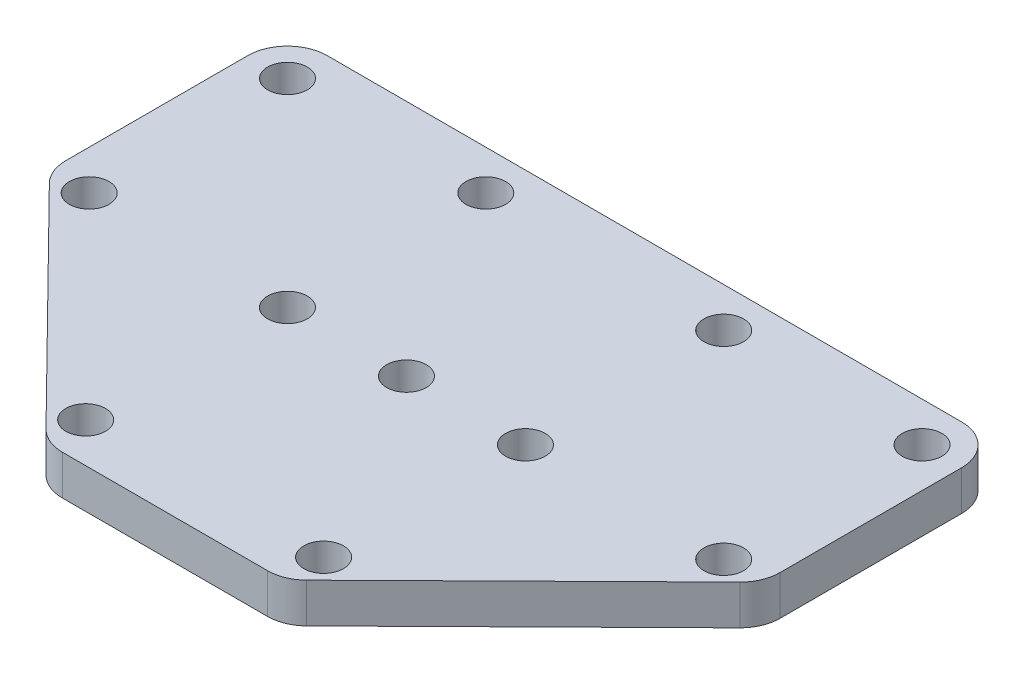
ISO-10303-21;
HEADER;
FILE_DESCRIPTION(('STEP AP214'),'2;1');
FILE_NAME('part.step','',(''),(''),'','','');
FILE_SCHEMA(('AUTOMOTIVE_DESIGN { 1 0 10303 214 1 1 1 1 }'));
ENDSEC;
DATA;
#1=APPLICATION_CONTEXT('core data for automotive mechanical design processes');
#2=APPLICATION_PROTOCOL_DEFINITION('international standard','automotive_design',2000,#1);
#3=PRODUCT_CONTEXT('',#1,'mechanical');
#4=PRODUCT('Part','Part','',(#3));
#5=PRODUCT_RELATED_PRODUCT_CATEGORY('part','',(#4));
#6=PRODUCT_DEFINITION_FORMATION('','',#4);
#7=PRODUCT_DEFINITION_CONTEXT('part definition',#1,'design');
#8=PRODUCT_DEFINITION('design','',#6,#7);
#9=PRODUCT_DEFINITION_SHAPE('','',#8);
#10=(LENGTH_UNIT() NAMED_UNIT(*) SI_UNIT(.MILLI.,.METRE.));
#11=(NAMED_UNIT(*) PLANE_ANGLE_UNIT() SI_UNIT($,.RADIAN.));
#12=(NAMED_UNIT(*) SI_UNIT($,.STERADIAN.) SOLID_ANGLE_UNIT());
#13=UNCERTAINTY_MEASURE_WITH_UNIT(LENGTH_MEASURE(1.E-05),#10,'distance_accuracy_value','');
#14=(GEOMETRIC_REPRESENTATION_CONTEXT(3) GLOBAL_UNCERTAINTY_ASSIGNED_CONTEXT((#13)) GLOBAL_UNIT_ASSIGNED_CONTEXT((#10,
#11,#12)) REPRESENTATION_CONTEXT('',''));
#15=CARTESIAN_POINT('',(0.,0.,0.));
#16=DIRECTION('',(0.,0.,1.));
#17=DIRECTION('',(1.,0.,0.));
#18=AXIS2_PLACEMENT_3D('',#15,#16,#17);
#19=CARTESIAN_POINT('',(-131.471489952786,12.7,-38.2334337337742));
#20=DIRECTION('',(0.,-1.,0.));
#21=DIRECTION('',(0.,0.,-1.));
#22=AXIS2_PLACEMENT_3D('',#19,#20,#21);
#23=CYLINDRICAL_SURFACE('',#22,12.6999999999999);
#24=CARTESIAN_POINT('',(-131.471489952786,0.,-38.2334337337742));
#25=DIRECTION('',(0.,1.,0.));
#26=DIRECTION('',(0.,0.,-1.));
#27=AXIS2_PLACEMENT_3D('',#24,#25,#26);
#28=CIRCLE('',#27,12.6999999999999);
#29=CARTESIAN_POINT('',(-144.171489952786,0.,-38.2334337337742));
#30=VERTEX_POINT('',#29);
#31=CARTESIAN_POINT('',(-140.522107102558,0.,-29.3240942965171));
#32=VERTEX_POINT('',#31);
#33=EDGE_CURVE('E159',#30,#32,#28,.T.);
#34=ORIENTED_EDGE('',*,*,#33,.T.);
#35=DIRECTION('',(0.,-1.,0.));
#36=VECTOR('',#35,1.);
#37=CARTESIAN_POINT('',(-140.522107102558,12.7,-29.3240942965171));
#38=LINE('',#37,#36);
#39=CARTESIAN_POINT('',(-140.522107102558,12.7,-29.3240942965171));
#40=VERTEX_POINT('',#39);
#41=EDGE_CURVE('E11',#40,#32,#38,.T.);
#42=ORIENTED_EDGE('',*,*,#41,.F.);
#43=CARTESIAN_POINT('',(-131.471489952786,12.7,-38.2334337337742));
#44=DIRECTION('',(0.,1.,0.));
#45=DIRECTION('',(0.,0.,-1.));
#46=AXIS2_PLACEMENT_3D('',#43,#44,#45);
#47=CIRCLE('',#46,12.6999999999999);
#48=CARTESIAN_POINT('',(-144.171489952786,12.7,-38.2334337337742));
#49=VERTEX_POINT('',#48);
#50=EDGE_CURVE('E182',#49,#40,#47,.T.);
#51=ORIENTED_EDGE('',*,*,#50,.F.);
#52=DIRECTION('',(0.,-1.,0.));
#53=VECTOR('',#52,1.);
#54=CARTESIAN_POINT('',(-144.171489952786,12.7,-38.2334337337742));
#55=LINE('',#54,#53);
#56=EDGE_CURVE('E155',#49,#30,#55,.T.);
#57=ORIENTED_EDGE('',*,*,#56,.T.);
#58=EDGE_LOOP('',(#34,#42,#51,#57));
#59=FACE_BOUND('',#58,.T.);
#60=ADVANCED_FACE('F39',(#59),#23,.T.);
#61=CARTESIAN_POINT('',(-140.522107102558,12.7,-29.3240942965171));
#62=DIRECTION('',(0.712647019667029,0.,-0.701522790335211));
#63=DIRECTION('',(-0.701522790335211,0.,-0.712647019667029));
#64=AXIS2_PLACEMENT_3D('',#61,#62,#63);
#65=PLANE('',#64);
#66=DIRECTION('',(0.701522790335211,0.,0.712647019667029));
#67=VECTOR('',#66,1.);
#68=CARTESIAN_POINT('',(-140.522107102558,0.,-29.3240942965171));
#69=LINE('',#68,#67);
#70=CARTESIAN_POINT('',(-72.8924409334163,0.,39.3779930775579));
#71=VERTEX_POINT('',#70);
#72=EDGE_CURVE('E162',#32,#71,#69,.T.);
#73=ORIENTED_EDGE('',*,*,#72,.T.);
#74=DIRECTION('',(0.,-1.,0.));
#75=VECTOR('',#74,1.);
#76=CARTESIAN_POINT('',(-72.8924409334163,12.7,39.3779930775579));
#77=LINE('',#76,#75);
#78=CARTESIAN_POINT('',(-72.8924409334163,12.7,39.3779930775579));
#79=VERTEX_POINT('',#78);
#80=EDGE_CURVE('E47',#79,#71,#77,.T.);
#81=ORIENTED_EDGE('',*,*,#80,.F.);
#82=DIRECTION('',(0.701522790335211,0.,0.712647019667029));
#83=VECTOR('',#82,1.);
#84=CARTESIAN_POINT('',(-140.522107102558,12.7,-29.3240942965171));
#85=LINE('',#84,#83);
#86=EDGE_CURVE('E110',#40,#79,#85,.T.);
#87=ORIENTED_EDGE('',*,*,#86,.F.);
#88=ORIENTED_EDGE('',*,*,#41,.T.);
#89=EDGE_LOOP('',(#73,#81,#87,#88));
#90=FACE_BOUND('',#89,.T.);
#91=ADVANCED_FACE('F261',(#90),#65,.F.);
#92=CARTESIAN_POINT('',(-63.8418237836473,12.7,30.4686536403008));
#93=DIRECTION('',(0.,-1.,0.));
#94=DIRECTION('',(0.,0.,-1.));
#95=AXIS2_PLACEMENT_3D('',#92,#93,#94);
#96=CYLINDRICAL_SURFACE('',#95,12.6999999999992);
#97=CARTESIAN_POINT('',(-63.8418237836473,0.,30.4686536403008));
#98=DIRECTION('',(0.,1.,0.));
#99=DIRECTION('',(0.,0.,-1.));
#100=AXIS2_PLACEMENT_3D('',#97,#98,#99);
#101=CIRCLE('',#100,12.6999999999992);
#102=CARTESIAN_POINT('',(-63.8418237836451,0.,43.1686536402999));
#103=VERTEX_POINT('',#102);
#104=EDGE_CURVE('E165',#71,#103,#101,.T.);
#105=ORIENTED_EDGE('',*,*,#104,.T.);
#106=DIRECTION('',(0.,-1.,0.));
#107=VECTOR('',#106,1.);
#108=CARTESIAN_POINT('',(-63.8418237836451,12.7,43.1686536402999));
#109=LINE('',#108,#107);
#110=CARTESIAN_POINT('',(-63.8418237836451,12.7,43.1686536402999));
#111=VERTEX_POINT('',#110);
#112=EDGE_CURVE('E201',#111,#103,#109,.T.);
#113=ORIENTED_EDGE('',*,*,#112,.F.);
#114=CARTESIAN_POINT('',(-63.8418237836473,12.7,30.4686536403008));
#115=DIRECTION('',(0.,1.,0.));
#116=DIRECTION('',(0.,0.,-1.));
#117=AXIS2_PLACEMENT_3D('',#114,#115,#116);
#118=CIRCLE('',#117,12.6999999999992);
#119=EDGE_CURVE('E209',#79,#111,#118,.T.);
#120=ORIENTED_EDGE('',*,*,#119,.F.);
#121=ORIENTED_EDGE('',*,*,#80,.T.);
#122=EDGE_LOOP('',(#105,#113,#120,#121));
#123=FACE_BOUND('',#122,.T.);
#124=ADVANCED_FACE('F207',(#123),#96,.T.);
#125=CARTESIAN_POINT('',(-63.8418237836451,12.7,43.1686536403008));
#126=DIRECTION('',(0.,0.,-1.));
#127=DIRECTION('',(-1.,0.,0.));
#128=AXIS2_PLACEMENT_3D('',#125,#126,#127);
#129=PLANE('',#128);
#130=DIRECTION('',(1.,0.,0.));
#131=VECTOR('',#130,1.);
#132=CARTESIAN_POINT('',(-63.8418237836451,0.,43.1686536403008));
#133=LINE('',#132,#131);
#134=CARTESIAN_POINT('',(1.83605760066149,0.,43.1686536403007));
#135=VERTEX_POINT('',#134);
#136=EDGE_CURVE('E167',#103,#135,#133,.T.);
#137=ORIENTED_EDGE('',*,*,#136,.T.);
#138=DIRECTION('',(0.,-1.,0.));
#139=VECTOR('',#138,1.);
#140=CARTESIAN_POINT('',(1.83605760066149,12.7,43.1686536403007));
#141=LINE('',#140,#139);
#142=CARTESIAN_POINT('',(1.83605760066149,12.7,43.1686536403007));
#143=VERTEX_POINT('',#142);
#144=EDGE_CURVE('E198',#143,#135,#141,.T.);
#145=ORIENTED_EDGE('',*,*,#144,.F.);
#146=DIRECTION('',(1.,0.,0.));
#147=VECTOR('',#146,1.);
#148=CARTESIAN_POINT('',(-63.8418237836451,12.7,43.1686536403008));
#149=LINE('',#148,#147);
#150=EDGE_CURVE('E227',#111,#143,#149,.T.);
#151=ORIENTED_EDGE('',*,*,#150,.F.);
#152=ORIENTED_EDGE('',*,*,#112,.T.);
#153=EDGE_LOOP('',(#137,#145,#151,#152));
#154=FACE_BOUND('',#153,.T.);
#155=ADVANCED_FACE('F218',(#154),#129,.F.);
#156=CARTESIAN_POINT('',(1.83605760065925,12.7,30.4686536403008));
#157=DIRECTION('',(0.,-1.,0.));
#158=DIRECTION('',(0.,0.,-1.));
#159=AXIS2_PLACEMENT_3D('',#156,#157,#158);
#160=CYLINDRICAL_SURFACE('',#159,12.7000000000008);
#161=CARTESIAN_POINT('',(1.83605760065925,0.,30.4686536403008));
#162=DIRECTION('',(0.,1.,0.));
#163=DIRECTION('',(0.,0.,-1.));
#164=AXIS2_PLACEMENT_3D('',#161,#162,#163);
#165=CIRCLE('',#164,12.7000000000008);
#166=CARTESIAN_POINT('',(10.7464996254383,0.,39.5181852813897));
#167=VERTEX_POINT('',#166);
#168=EDGE_CURVE('E169',#135,#167,#165,.T.);
#169=ORIENTED_EDGE('',*,*,#168,.T.);
#170=DIRECTION('',(0.,-1.,0.));
#171=VECTOR('',#170,1.);
#172=CARTESIAN_POINT('',(10.7464996254383,12.7,39.5181852813897));
#173=LINE('',#172,#171);
#174=CARTESIAN_POINT('',(10.7464996254383,12.7,39.5181852813897));
#175=VERTEX_POINT('',#174);
#176=EDGE_CURVE('E195',#175,#167,#173,.T.);
#177=ORIENTED_EDGE('',*,*,#176,.F.);
#178=CARTESIAN_POINT('',(1.83605760065925,12.7,30.4686536403008));
#179=DIRECTION('',(0.,1.,0.));
#180=DIRECTION('',(0.,0.,-1.));
#181=AXIS2_PLACEMENT_3D('',#178,#179,#180);
#182=CIRCLE('',#181,12.7000000000008);
#183=EDGE_CURVE('E224',#143,#175,#182,.T.);
#184=ORIENTED_EDGE('',*,*,#183,.F.);
#185=ORIENTED_EDGE('',*,*,#144,.T.);
#186=EDGE_LOOP('',(#169,#177,#184,#185));
#187=FACE_BOUND('',#186,.T.);
#188=ADVANCED_FACE('F222',(#187),#160,.T.);
#189=CARTESIAN_POINT('',(80.6389520719911,12.7,-29.3000331849449));
#190=DIRECTION('',(-0.701609608250188,0.,-0.712561546542485));
#191=DIRECTION('',(-0.712561546542485,0.,0.701609608250188));
#192=AXIS2_PLACEMENT_3D('',#189,#190,#191);
#193=PLANE('',#192);
#194=DIRECTION('',(0.712561546542485,0.,-0.701609608250188));
#195=VECTOR('',#194,1.);
#196=CARTESIAN_POINT('',(80.6389520719911,0.,-29.3000331849449));
#197=LINE('',#196,#195);
#198=CARTESIAN_POINT('',(80.6389520719911,0.,-29.3000331849449));
#199=VERTEX_POINT('',#198);
#200=EDGE_CURVE('E171',#167,#199,#197,.T.);
#201=ORIENTED_EDGE('',*,*,#200,.T.);
#202=DIRECTION('',(0.,-1.,0.));
#203=VECTOR('',#202,1.);
#204=CARTESIAN_POINT('',(80.6389520719911,12.7,-29.3000331849449));
#205=LINE('',#204,#203);
#206=CARTESIAN_POINT('',(80.6389520719911,12.7,-29.3000331849449));
#207=VERTEX_POINT('',#206);
#208=EDGE_CURVE('E192',#207,#199,#205,.T.);
#209=ORIENTED_EDGE('',*,*,#208,.F.);
#210=DIRECTION('',(0.712561546542485,0.,-0.701609608250188));
#211=VECTOR('',#210,1.);
#212=CARTESIAN_POINT('',(80.6389520719911,12.7,-29.3000331849449));
#213=LINE('',#212,#211);
#214=EDGE_CURVE('E226',#175,#207,#213,.T.);
#215=ORIENTED_EDGE('',*,*,#214,.F.);
#216=ORIENTED_EDGE('',*,*,#176,.T.);
#217=EDGE_LOOP('',(#201,#209,#215,#216));
#218=FACE_BOUND('',#217,.T.);
#219=ADVANCED_FACE('F274',(#218),#193,.F.);
#220=CARTESIAN_POINT('',(71.7285100472137,12.7,-38.3495648260345));
#221=DIRECTION('',(0.,-1.,0.));
#222=DIRECTION('',(0.,0.,-1.));
#223=AXIS2_PLACEMENT_3D('',#220,#221,#222);
#224=CYLINDRICAL_SURFACE('',#223,12.7);
#225=CARTESIAN_POINT('',(71.7285100472137,0.,-38.3495648260345));
#226=DIRECTION('',(0.,1.,0.));
#227=DIRECTION('',(0.,0.,-1.));
#228=AXIS2_PLACEMENT_3D('',#225,#226,#227);
#229=CIRCLE('',#228,12.7);
#230=CARTESIAN_POINT('',(84.4285100472137,0.,-38.3495648260345));
#231=VERTEX_POINT('',#230);
#232=EDGE_CURVE('E173',#199,#231,#229,.T.);
#233=ORIENTED_EDGE('',*,*,#232,.T.);
#234=DIRECTION('',(0.,-1.,0.));
#235=VECTOR('',#234,1.);
#236=CARTESIAN_POINT('',(84.4285100472137,12.7,-38.3495648260345));
#237=LINE('',#236,#235);
#238=CARTESIAN_POINT('',(84.4285100472137,12.7,-38.3495648260345));
#239=VERTEX_POINT('',#238);
#240=EDGE_CURVE('E189',#239,#231,#237,.T.);
#241=ORIENTED_EDGE('',*,*,#240,.F.);
#242=CARTESIAN_POINT('',(71.7285100472137,12.7,-38.3495648260345));
#243=DIRECTION('',(0.,1.,0.));
#244=DIRECTION('',(0.,0.,-1.));
#245=AXIS2_PLACEMENT_3D('',#242,#243,#244);
#246=CIRCLE('',#245,12.7);
#247=EDGE_CURVE('E229',#207,#239,#246,.T.);
#248=ORIENTED_EDGE('',*,*,#247,.F.);
#249=ORIENTED_EDGE('',*,*,#208,.T.);
#250=EDGE_LOOP('',(#233,#241,#248,#249));
#251=FACE_BOUND('',#250,.T.);
#252=ADVANCED_FACE('F277',(#251),#224,.T.);
#253=CARTESIAN_POINT('',(84.4285100472137,12.7,-96.5313463596992));
#254=DIRECTION('',(-1.,0.,0.));
#255=DIRECTION('',(0.,0.,1.));
#256=AXIS2_PLACEMENT_3D('',#253,#254,#255);
#257=PLANE('',#256);
#258=DIRECTION('',(0.,0.,-1.));
#259=VECTOR('',#258,1.);
#260=CARTESIAN_POINT('',(84.4285100472137,0.,-96.5313463596992));
#261=LINE('',#260,#259);
#262=CARTESIAN_POINT('',(84.4285100472137,0.,-96.5313463596992));
#263=VERTEX_POINT('',#262);
#264=EDGE_CURVE('E175',#231,#263,#261,.T.);
#265=ORIENTED_EDGE('',*,*,#264,.T.);
#266=DIRECTION('',(0.,-1.,0.));
#267=VECTOR('',#266,1.);
#268=CARTESIAN_POINT('',(84.4285100472137,12.7,-96.5313463596992));
#269=LINE('',#268,#267);
#270=CARTESIAN_POINT('',(84.4285100472137,12.7,-96.5313463596992));
#271=VERTEX_POINT('',#270);
#272=EDGE_CURVE('E186',#271,#263,#269,.T.);
#273=ORIENTED_EDGE('',*,*,#272,.F.);
#274=DIRECTION('',(0.,0.,-1.));
#275=VECTOR('',#274,1.);
#276=CARTESIAN_POINT('',(84.4285100472137,12.7,-96.5313463596992));
#277=LINE('',#276,#275);
#278=EDGE_CURVE('E235',#239,#271,#277,.T.);
#279=ORIENTED_EDGE('',*,*,#278,.F.);
#280=ORIENTED_EDGE('',*,*,#240,.T.);
#281=EDGE_LOOP('',(#265,#273,#279,#280));
#282=FACE_BOUND('',#281,.T.);
#283=ADVANCED_FACE('F241',(#282),#257,.F.);
#284=CARTESIAN_POINT('',(71.7285100472137,12.7,-96.5313463596993));
#285=DIRECTION('',(0.,-1.,0.));
#286=DIRECTION('',(0.,0.,-1.));
#287=AXIS2_PLACEMENT_3D('',#284,#285,#286);
#288=CYLINDRICAL_SURFACE('',#287,12.7);
#289=CARTESIAN_POINT('',(71.7285100472137,0.,-96.5313463596993));
#290=DIRECTION('',(0.,1.,0.));
#291=DIRECTION('',(0.,0.,1.));
#292=AXIS2_PLACEMENT_3D('',#289,#290,#291);
#293=CIRCLE('',#292,12.7);
#294=CARTESIAN_POINT('',(71.7285100472136,0.,-109.231346359699));
#295=VERTEX_POINT('',#294);
#296=EDGE_CURVE('E177',#263,#295,#293,.T.);
#297=ORIENTED_EDGE('',*,*,#296,.T.);
#298=DIRECTION('',(0.,-1.,0.));
#299=VECTOR('',#298,1.);
#300=CARTESIAN_POINT('',(71.7285100472136,12.7,-109.231346359699));
#301=LINE('',#300,#299);
#302=CARTESIAN_POINT('',(71.7285100472136,12.7,-109.231346359699));
#303=VERTEX_POINT('',#302);
#304=EDGE_CURVE('E150',#303,#295,#301,.T.);
#305=ORIENTED_EDGE('',*,*,#304,.F.);
#306=CARTESIAN_POINT('',(71.7285100472137,12.7,-96.5313463596993));
#307=DIRECTION('',(0.,1.,0.));
#308=DIRECTION('',(0.,0.,1.));
#309=AXIS2_PLACEMENT_3D('',#306,#307,#308);
#310=CIRCLE('',#309,12.7);
#311=EDGE_CURVE('E141',#271,#303,#310,.T.);
#312=ORIENTED_EDGE('',*,*,#311,.F.);
#313=ORIENTED_EDGE('',*,*,#272,.T.);
#314=EDGE_LOOP('',(#297,#305,#312,#313));
#315=FACE_BOUND('',#314,.T.);
#316=ADVANCED_FACE('F245',(#315),#288,.T.);
#317=CARTESIAN_POINT('',(-131.471489952786,12.7,-109.231346359699));
#318=DIRECTION('',(0.,0.,1.));
#319=DIRECTION('',(1.,0.,0.));
#320=AXIS2_PLACEMENT_3D('',#317,#318,#319);
#321=PLANE('',#320);
#322=DIRECTION('',(-1.,0.,0.));
#323=VECTOR('',#322,1.);
#324=CARTESIAN_POINT('',(-131.471489952786,0.,-109.231346359699));
#325=LINE('',#324,#323);
#326=CARTESIAN_POINT('',(-131.471489952786,0.,-109.231346359699));
#327=VERTEX_POINT('',#326);
#328=EDGE_CURVE('E149',#295,#327,#325,.T.);
#329=ORIENTED_EDGE('',*,*,#328,.T.);
#330=DIRECTION('',(0.,-1.,0.));
#331=VECTOR('',#330,1.);
#332=CARTESIAN_POINT('',(-131.471489952786,12.7,-109.231346359699));
#333=LINE('',#332,#331);
#334=CARTESIAN_POINT('',(-131.471489952786,12.7,-109.231346359699));
#335=VERTEX_POINT('',#334);
#336=EDGE_CURVE('E146',#335,#327,#333,.T.);
#337=ORIENTED_EDGE('',*,*,#336,.F.);
#338=DIRECTION('',(-1.,0.,0.));
#339=VECTOR('',#338,1.);
#340=CARTESIAN_POINT('',(-131.471489952786,12.7,-109.231346359699));
#341=LINE('',#340,#339);
#342=EDGE_CURVE('E135',#303,#335,#341,.T.);
#343=ORIENTED_EDGE('',*,*,#342,.F.);
#344=ORIENTED_EDGE('',*,*,#304,.T.);
#345=EDGE_LOOP('',(#329,#337,#343,#344));
#346=FACE_BOUND('',#345,.T.);
#347=ADVANCED_FACE('F147',(#346),#321,.F.);
#348=CARTESIAN_POINT('',(-131.471489952786,12.7,-96.5313463596993));
#349=DIRECTION('',(0.,-1.,0.));
#350=DIRECTION('',(0.,0.,-1.));
#351=AXIS2_PLACEMENT_3D('',#348,#349,#350);
#352=CYLINDRICAL_SURFACE('',#351,12.7);
#353=CARTESIAN_POINT('',(-131.471489952786,0.,-96.5313463596993));
#354=DIRECTION('',(0.,1.,0.));
#355=DIRECTION('',(0.,0.,1.));
#356=AXIS2_PLACEMENT_3D('',#353,#354,#355);
#357=CIRCLE('',#356,12.7);
#358=CARTESIAN_POINT('',(-144.171489952786,0.,-96.5313463596992));
#359=VERTEX_POINT('',#358);
#360=EDGE_CURVE('E96',#327,#359,#357,.T.);
#361=ORIENTED_EDGE('',*,*,#360,.T.);
#362=DIRECTION('',(0.,-1.,0.));
#363=VECTOR('',#362,1.);
#364=CARTESIAN_POINT('',(-144.171489952786,12.7,-96.5313463596992));
#365=LINE('',#364,#363);
#366=CARTESIAN_POINT('',(-144.171489952786,12.7,-96.5313463596992));
#367=VERTEX_POINT('',#366);
#368=EDGE_CURVE('E151',#367,#359,#365,.T.);
#369=ORIENTED_EDGE('',*,*,#368,.F.);
#370=CARTESIAN_POINT('',(-131.471489952786,12.7,-96.5313463596993));
#371=DIRECTION('',(0.,1.,0.));
#372=DIRECTION('',(0.,0.,1.));
#373=AXIS2_PLACEMENT_3D('',#370,#371,#372);
#374=CIRCLE('',#373,12.7);
#375=EDGE_CURVE('E139',#335,#367,#374,.T.);
#376=ORIENTED_EDGE('',*,*,#375,.F.);
#377=ORIENTED_EDGE('',*,*,#336,.T.);
#378=EDGE_LOOP('',(#361,#369,#376,#377));
#379=FACE_BOUND('',#378,.T.);
#380=ADVANCED_FACE('F153',(#379),#352,.T.);
#381=CARTESIAN_POINT('',(-144.171489952786,12.7,-96.5313463596992));
#382=DIRECTION('',(1.,0.,0.));
#383=DIRECTION('',(0.,0.,-1.));
#384=AXIS2_PLACEMENT_3D('',#381,#382,#383);
#385=PLANE('',#384);
#386=DIRECTION('',(0.,0.,1.));
#387=VECTOR('',#386,1.);
#388=CARTESIAN_POINT('',(-144.171489952786,0.,-96.5313463596992));
#389=LINE('',#388,#387);
#390=EDGE_CURVE('E102',#359,#30,#389,.T.);
#391=ORIENTED_EDGE('',*,*,#390,.T.);
#392=ORIENTED_EDGE('',*,*,#56,.F.);
#393=DIRECTION('',(0.,0.,1.));
#394=VECTOR('',#393,1.);
#395=CARTESIAN_POINT('',(-144.171489952786,12.7,-96.5313463596992));
#396=LINE('',#395,#394);
#397=EDGE_CURVE('E55',#367,#49,#396,.T.);
#398=ORIENTED_EDGE('',*,*,#397,.F.);
#399=ORIENTED_EDGE('',*,*,#368,.T.);
#400=EDGE_LOOP('',(#391,#392,#398,#399));
#401=FACE_BOUND('',#400,.T.);
#402=ADVANCED_FACE('F249',(#401),#385,.F.);
#403=CARTESIAN_POINT('',(-131.471489952786,12.7,-38.2334337337742));
#404=DIRECTION('',(0.,-1.,0.));
#405=DIRECTION('',(0.,0.,-1.));
#406=AXIS2_PLACEMENT_3D('',#403,#404,#405);
#407=PLANE('',#406);
#408=CARTESIAN_POINT('',(71.7285100472137,12.7,-33.0313463596992));
#409=DIRECTION('',(0.,1.,0.));
#410=DIRECTION('',(0.,0.,1.));
#411=AXIS2_PLACEMENT_3D('',#408,#409,#410);
#412=CIRCLE('',#411,6.34999999999789);
#413=CARTESIAN_POINT('',(71.7285100472137,12.7,-26.6813463597013));
#414=VERTEX_POINT('',#413);
#415=EDGE_CURVE('E433',#414,#414,#412,.T.);
#416=ORIENTED_EDGE('',*,*,#415,.F.);
#417=EDGE_LOOP('',(#416));
#418=FACE_BOUND('',#417,.T.);
#419=CARTESIAN_POINT('',(71.7285100472137,12.7,-96.5313463596992));
#420=DIRECTION('',(0.,1.,0.));
#421=DIRECTION('',(0.,0.,1.));
#422=AXIS2_PLACEMENT_3D('',#419,#420,#421);
#423=CIRCLE('',#422,6.35000000000002);
#424=CARTESIAN_POINT('',(71.7285100472137,12.7,-90.1813463596992));
#425=VERTEX_POINT('',#424);
#426=EDGE_CURVE('E435',#425,#425,#423,.T.);
#427=ORIENTED_EDGE('',*,*,#426,.F.);
#428=EDGE_LOOP('',(#427));
#429=FACE_BOUND('',#428,.T.);
#430=CARTESIAN_POINT('',(-67.9714899527863,12.7,-96.5313463596992));
#431=DIRECTION('',(0.,1.,0.));
#432=DIRECTION('',(0.,0.,1.));
#433=AXIS2_PLACEMENT_3D('',#430,#431,#432);
#434=CIRCLE('',#433,6.34999999999788);
#435=CARTESIAN_POINT('',(-67.9714899527863,12.7,-90.1813463597014));
#436=VERTEX_POINT('',#435);
#437=EDGE_CURVE('E449',#436,#436,#434,.T.);
#438=ORIENTED_EDGE('',*,*,#437,.F.);
#439=EDGE_LOOP('',(#438));
#440=FACE_BOUND('',#439,.T.);
#441=CARTESIAN_POINT('',(8.22851004721369,12.7,-96.5313463596992));
#442=DIRECTION('',(0.,1.,0.));
#443=DIRECTION('',(0.,0.,1.));
#444=AXIS2_PLACEMENT_3D('',#441,#442,#443);
#445=CIRCLE('',#444,6.34999999999787);
#446=CARTESIAN_POINT('',(8.22851004721369,12.7,-90.1813463597014));
#447=VERTEX_POINT('',#446);
#448=EDGE_CURVE('E462',#447,#447,#445,.T.);
#449=ORIENTED_EDGE('',*,*,#448,.F.);
#450=EDGE_LOOP('',(#449));
#451=FACE_BOUND('',#450,.T.);
#452=CARTESIAN_POINT('',(-67.9714892860843,12.7,-33.0212664105009));
#453=DIRECTION('',(0.,1.,0.));
#454=DIRECTION('',(0.,0.,1.));
#455=AXIS2_PLACEMENT_3D('',#452,#453,#454);
#456=CIRCLE('',#455,6.34999999999761);
#457=CARTESIAN_POINT('',(-67.9714892860843,12.7,-26.6712664105033));
#458=VERTEX_POINT('',#457);
#459=EDGE_CURVE('E468',#458,#458,#456,.T.);
#460=ORIENTED_EDGE('',*,*,#459,.F.);
#461=EDGE_LOOP('',(#460));
#462=FACE_BOUND('',#461,.T.);
#463=CARTESIAN_POINT('',(-69.1028830914918,12.7,30.4686536402999));
#464=DIRECTION('',(0.,1.,0.));
#465=DIRECTION('',(0.,0.,1.));
#466=AXIS2_PLACEMENT_3D('',#463,#464,#465);
#467=CIRCLE('',#466,6.34999999999762);
#468=CARTESIAN_POINT('',(-69.1028830914918,12.7,36.8186536402976));
#469=VERTEX_POINT('',#468);
#470=EDGE_CURVE('E474',#469,#469,#467,.T.);
#471=ORIENTED_EDGE('',*,*,#470,.F.);
#472=EDGE_LOOP('',(#471));
#473=FACE_BOUND('',#472,.T.);
#474=CARTESIAN_POINT('',(7.09711690850821,12.7,30.4686536403));
#475=DIRECTION('',(0.,1.,0.));
#476=DIRECTION('',(0.,0.,1.));
#477=AXIS2_PLACEMENT_3D('',#474,#475,#476);
#478=CIRCLE('',#477,6.34999999999761);
#479=CARTESIAN_POINT('',(7.09711690850821,12.7,36.8186536402976));
#480=VERTEX_POINT('',#479);
#481=EDGE_CURVE('E496',#480,#480,#478,.T.);
#482=ORIENTED_EDGE('',*,*,#481,.F.);
#483=EDGE_LOOP('',(#482));
#484=FACE_BOUND('',#483,.T.);
#485=CARTESIAN_POINT('',(8.22851004721373,12.7,-33.0313463597001));
#486=DIRECTION('',(0.,1.,0.));
#487=DIRECTION('',(0.,0.,1.));
#488=AXIS2_PLACEMENT_3D('',#485,#486,#487);
#489=CIRCLE('',#488,6.3499999999976);
#490=CARTESIAN_POINT('',(8.22851004721373,12.7,-26.6813463597025));
#491=VERTEX_POINT('',#490);
#492=EDGE_CURVE('E500',#491,#491,#489,.T.);
#493=ORIENTED_EDGE('',*,*,#492,.F.);
#494=EDGE_LOOP('',(#493));
#495=FACE_BOUND('',#494,.T.);
#496=CARTESIAN_POINT('',(-131.471489952786,12.7,-96.5313463596992));
#497=DIRECTION('',(0.,1.,0.));
#498=DIRECTION('',(0.,0.,1.));
#499=AXIS2_PLACEMENT_3D('',#496,#497,#498);
#500=CIRCLE('',#499,6.35000000000002);
#501=CARTESIAN_POINT('',(-131.471489952786,12.7,-90.1813463596992));
#502=VERTEX_POINT('',#501);
#503=EDGE_CURVE('E504',#502,#502,#500,.T.);
#504=ORIENTED_EDGE('',*,*,#503,.F.);
#505=EDGE_LOOP('',(#504));
#506=FACE_BOUND('',#505,.T.);
#507=CARTESIAN_POINT('',(-131.471489952786,12.7,-33.0313463596992));
#508=DIRECTION('',(0.,1.,0.));
#509=DIRECTION('',(0.,0.,1.));
#510=AXIS2_PLACEMENT_3D('',#507,#508,#509);
#511=CIRCLE('',#510,6.35000000000002);
#512=CARTESIAN_POINT('',(-131.471489952786,12.7,-26.6813463596992));
#513=VERTEX_POINT('',#512);
#514=EDGE_CURVE('E457',#513,#513,#511,.T.);
#515=ORIENTED_EDGE('',*,*,#514,.F.);
#516=EDGE_LOOP('',(#515));
#517=FACE_BOUND('',#516,.T.);
#518=CARTESIAN_POINT('',(-29.8714906194882,12.7,-33.0313463597001));
#519=DIRECTION('',(0.,1.,0.));
#520=DIRECTION('',(0.,0.,1.));
#521=AXIS2_PLACEMENT_3D('',#518,#519,#520);
#522=CIRCLE('',#521,6.35);
#523=CARTESIAN_POINT('',(-29.8714906194882,12.7,-26.6813463597001));
#524=VERTEX_POINT('',#523);
#525=EDGE_CURVE('E441',#524,#524,#522,.T.);
#526=ORIENTED_EDGE('',*,*,#525,.F.);
#527=EDGE_LOOP('',(#526));
#528=FACE_BOUND('',#527,.T.);
#529=ORIENTED_EDGE('',*,*,#50,.T.);
#530=ORIENTED_EDGE('',*,*,#86,.T.);
#531=ORIENTED_EDGE('',*,*,#119,.T.);
#532=ORIENTED_EDGE('',*,*,#150,.T.);
#533=ORIENTED_EDGE('',*,*,#183,.T.);
#534=ORIENTED_EDGE('',*,*,#214,.T.);
#535=ORIENTED_EDGE('',*,*,#247,.T.);
#536=ORIENTED_EDGE('',*,*,#278,.T.);
#537=ORIENTED_EDGE('',*,*,#311,.T.);
#538=ORIENTED_EDGE('',*,*,#342,.T.);
#539=ORIENTED_EDGE('',*,*,#375,.T.);
#540=ORIENTED_EDGE('',*,*,#397,.T.);
#541=EDGE_LOOP('',(#529,#530,#531,#532,#533,#534,#535,#536,#537,#538,#539,#540));
#542=FACE_BOUND('',#541,.T.);
#543=ADVANCED_FACE('F137',(#418,#429,#440,#451,#462,#473,#484,#495,#506,#517,#528,#542),#407,.F.);
#544=CARTESIAN_POINT('',(-131.471489952786,0.,-38.2334337337742));
#545=DIRECTION('',(0.,-1.,0.));
#546=DIRECTION('',(0.,0.,-1.));
#547=AXIS2_PLACEMENT_3D('',#544,#545,#546);
#548=PLANE('',#547);
#549=CARTESIAN_POINT('',(71.7285100472137,0.,-33.0313463596992));
#550=DIRECTION('',(0.,1.,0.));
#551=DIRECTION('',(0.,0.,1.));
#552=AXIS2_PLACEMENT_3D('',#549,#550,#551);
#553=CIRCLE('',#552,6.34999999999789);
#554=CARTESIAN_POINT('',(71.7285100472137,0.,-26.6813463597013));
#555=VERTEX_POINT('',#554);
#556=EDGE_CURVE('E430',#555,#555,#553,.T.);
#557=ORIENTED_EDGE('',*,*,#556,.T.);
#558=EDGE_LOOP('',(#557));
#559=FACE_BOUND('',#558,.T.);
#560=CARTESIAN_POINT('',(71.7285100472137,0.,-96.5313463596992));
#561=DIRECTION('',(0.,1.,0.));
#562=DIRECTION('',(0.,0.,1.));
#563=AXIS2_PLACEMENT_3D('',#560,#561,#562);
#564=CIRCLE('',#563,6.35000000000002);
#565=CARTESIAN_POINT('',(71.7285100472137,0.,-90.1813463596992));
#566=VERTEX_POINT('',#565);
#567=EDGE_CURVE('E478',#566,#566,#564,.T.);
#568=ORIENTED_EDGE('',*,*,#567,.T.);
#569=EDGE_LOOP('',(#568));
#570=FACE_BOUND('',#569,.T.);
#571=CARTESIAN_POINT('',(-67.9714899527863,0.,-96.5313463596992));
#572=DIRECTION('',(0.,1.,0.));
#573=DIRECTION('',(0.,0.,1.));
#574=AXIS2_PLACEMENT_3D('',#571,#572,#573);
#575=CIRCLE('',#574,6.34999999999788);
#576=CARTESIAN_POINT('',(-67.9714899527863,0.,-90.1813463597014));
#577=VERTEX_POINT('',#576);
#578=EDGE_CURVE('E444',#577,#577,#575,.T.);
#579=ORIENTED_EDGE('',*,*,#578,.T.);
#580=EDGE_LOOP('',(#579));
#581=FACE_BOUND('',#580,.T.);
#582=CARTESIAN_POINT('',(8.22851004721369,0.,-96.5313463596992));
#583=DIRECTION('',(0.,1.,0.));
#584=DIRECTION('',(0.,0.,1.));
#585=AXIS2_PLACEMENT_3D('',#582,#583,#584);
#586=CIRCLE('',#585,6.34999999999787);
#587=CARTESIAN_POINT('',(8.22851004721369,0.,-90.1813463597014));
#588=VERTEX_POINT('',#587);
#589=EDGE_CURVE('E454',#588,#588,#586,.T.);
#590=ORIENTED_EDGE('',*,*,#589,.T.);
#591=EDGE_LOOP('',(#590));
#592=FACE_BOUND('',#591,.T.);
#593=CARTESIAN_POINT('',(-67.9714892860843,0.,-33.0212664105009));
#594=DIRECTION('',(0.,1.,0.));
#595=DIRECTION('',(0.,0.,1.));
#596=AXIS2_PLACEMENT_3D('',#593,#594,#595);
#597=CIRCLE('',#596,6.34999999999761);
#598=CARTESIAN_POINT('',(-67.9714892860843,0.,-26.6712664105033));
#599=VERTEX_POINT('',#598);
#600=EDGE_CURVE('E465',#599,#599,#597,.T.);
#601=ORIENTED_EDGE('',*,*,#600,.T.);
#602=EDGE_LOOP('',(#601));
#603=FACE_BOUND('',#602,.T.);
#604=CARTESIAN_POINT('',(-69.1028830914918,0.,30.4686536402999));
#605=DIRECTION('',(0.,1.,0.));
#606=DIRECTION('',(0.,0.,1.));
#607=AXIS2_PLACEMENT_3D('',#604,#605,#606);
#608=CIRCLE('',#607,6.34999999999762);
#609=CARTESIAN_POINT('',(-69.1028830914918,0.,36.8186536402976));
#610=VERTEX_POINT('',#609);
#611=EDGE_CURVE('E471',#610,#610,#608,.T.);
#612=ORIENTED_EDGE('',*,*,#611,.T.);
#613=EDGE_LOOP('',(#612));
#614=FACE_BOUND('',#613,.T.);
#615=CARTESIAN_POINT('',(7.09711690850821,0.,30.4686536403));
#616=DIRECTION('',(0.,1.,0.));
#617=DIRECTION('',(0.,0.,1.));
#618=AXIS2_PLACEMENT_3D('',#615,#616,#617);
#619=CIRCLE('',#618,6.34999999999761);
#620=CARTESIAN_POINT('',(7.09711690850821,0.,36.8186536402976));
#621=VERTEX_POINT('',#620);
#622=EDGE_CURVE('E477',#621,#621,#619,.T.);
#623=ORIENTED_EDGE('',*,*,#622,.T.);
#624=EDGE_LOOP('',(#623));
#625=FACE_BOUND('',#624,.T.);
#626=CARTESIAN_POINT('',(8.22851004721373,0.,-33.0313463597001));
#627=DIRECTION('',(0.,1.,0.));
#628=DIRECTION('',(0.,0.,1.));
#629=AXIS2_PLACEMENT_3D('',#626,#627,#628);
#630=CIRCLE('',#629,6.3499999999976);
#631=CARTESIAN_POINT('',(8.22851004721373,0.,-26.6813463597025));
#632=VERTEX_POINT('',#631);
#633=EDGE_CURVE('E519',#632,#632,#630,.T.);
#634=ORIENTED_EDGE('',*,*,#633,.T.);
#635=EDGE_LOOP('',(#634));
#636=FACE_BOUND('',#635,.T.);
#637=CARTESIAN_POINT('',(-131.471489952786,0.,-96.5313463596992));
#638=DIRECTION('',(0.,1.,0.));
#639=DIRECTION('',(0.,0.,1.));
#640=AXIS2_PLACEMENT_3D('',#637,#638,#639);
#641=CIRCLE('',#640,6.35000000000002);
#642=CARTESIAN_POINT('',(-131.471489952786,0.,-90.1813463596992));
#643=VERTEX_POINT('',#642);
#644=EDGE_CURVE('E513',#643,#643,#641,.T.);
#645=ORIENTED_EDGE('',*,*,#644,.T.);
#646=EDGE_LOOP('',(#645));
#647=FACE_BOUND('',#646,.T.);
#648=CARTESIAN_POINT('',(-131.471489952786,0.,-33.0313463596992));
#649=DIRECTION('',(0.,1.,0.));
#650=DIRECTION('',(0.,0.,1.));
#651=AXIS2_PLACEMENT_3D('',#648,#649,#650);
#652=CIRCLE('',#651,6.35000000000002);
#653=CARTESIAN_POINT('',(-131.471489952786,0.,-26.6813463596992));
#654=VERTEX_POINT('',#653);
#655=EDGE_CURVE('E509',#654,#654,#652,.T.);
#656=ORIENTED_EDGE('',*,*,#655,.T.);
#657=EDGE_LOOP('',(#656));
#658=FACE_BOUND('',#657,.T.);
#659=CARTESIAN_POINT('',(-29.8714906194882,0.,-33.0313463597001));
#660=DIRECTION('',(0.,1.,0.));
#661=DIRECTION('',(0.,0.,1.));
#662=AXIS2_PLACEMENT_3D('',#659,#660,#661);
#663=CIRCLE('',#662,6.35);
#664=CARTESIAN_POINT('',(-29.8714906194882,0.,-26.6813463597001));
#665=VERTEX_POINT('',#664);
#666=EDGE_CURVE('E163',#665,#665,#663,.T.);
#667=ORIENTED_EDGE('',*,*,#666,.T.);
#668=EDGE_LOOP('',(#667));
#669=FACE_BOUND('',#668,.T.);
#670=ORIENTED_EDGE('',*,*,#33,.F.);
#671=ORIENTED_EDGE('',*,*,#390,.F.);
#672=ORIENTED_EDGE('',*,*,#360,.F.);
#673=ORIENTED_EDGE('',*,*,#328,.F.);
#674=ORIENTED_EDGE('',*,*,#296,.F.);
#675=ORIENTED_EDGE('',*,*,#264,.F.);
#676=ORIENTED_EDGE('',*,*,#232,.F.);
#677=ORIENTED_EDGE('',*,*,#200,.F.);
#678=ORIENTED_EDGE('',*,*,#168,.F.);
#679=ORIENTED_EDGE('',*,*,#136,.F.);
#680=ORIENTED_EDGE('',*,*,#104,.F.);
#681=ORIENTED_EDGE('',*,*,#72,.F.);
#682=EDGE_LOOP('',(#670,#671,#672,#673,#674,#675,#676,#677,#678,#679,#680,#681));
#683=FACE_BOUND('',#682,.T.);
#684=ADVANCED_FACE('F213',(#559,#570,#581,#592,#603,#614,#625,#636,#647,#658,#669,#683),#548,.T.);
#685=CARTESIAN_POINT('',(-29.8714906194882,0.,-33.0313463597001));
#686=DIRECTION('',(0.,1.,0.));
#687=DIRECTION('',(0.,0.,1.));
#688=AXIS2_PLACEMENT_3D('',#685,#686,#687);
#689=CYLINDRICAL_SURFACE('',#688,6.35);
#690=ORIENTED_EDGE('',*,*,#666,.F.);
#691=EDGE_LOOP('',(#690));
#692=FACE_BOUND('',#691,.T.);
#693=ORIENTED_EDGE('',*,*,#525,.T.);
#694=EDGE_LOOP('',(#693));
#695=FACE_BOUND('',#694,.T.);
#696=ADVANCED_FACE('F314',(#692,#695),#689,.F.);
#697=CARTESIAN_POINT('',(-131.471489952786,0.,-33.0313463596992));
#698=DIRECTION('',(0.,1.,0.));
#699=DIRECTION('',(0.,0.,1.));
#700=AXIS2_PLACEMENT_3D('',#697,#698,#699);
#701=CYLINDRICAL_SURFACE('',#700,6.35000000000002);
#702=ORIENTED_EDGE('',*,*,#655,.F.);
#703=EDGE_LOOP('',(#702));
#704=FACE_BOUND('',#703,.T.);
#705=ORIENTED_EDGE('',*,*,#514,.T.);
#706=EDGE_LOOP('',(#705));
#707=FACE_BOUND('',#706,.T.);
#708=ADVANCED_FACE('F323',(#704,#707),#701,.F.);
#709=CARTESIAN_POINT('',(-131.471489952786,0.,-96.5313463596992));
#710=DIRECTION('',(0.,1.,0.));
#711=DIRECTION('',(0.,0.,1.));
#712=AXIS2_PLACEMENT_3D('',#709,#710,#711);
#713=CYLINDRICAL_SURFACE('',#712,6.35000000000002);
#714=ORIENTED_EDGE('',*,*,#644,.F.);
#715=EDGE_LOOP('',(#714));
#716=FACE_BOUND('',#715,.T.);
#717=ORIENTED_EDGE('',*,*,#503,.T.);
#718=EDGE_LOOP('',(#717));
#719=FACE_BOUND('',#718,.T.);
#720=ADVANCED_FACE('F333',(#716,#719),#713,.F.);
#721=CARTESIAN_POINT('',(8.22851004721373,0.,-33.0313463597001));
#722=DIRECTION('',(0.,1.,0.));
#723=DIRECTION('',(0.,0.,1.));
#724=AXIS2_PLACEMENT_3D('',#721,#722,#723);
#725=CYLINDRICAL_SURFACE('',#724,6.3499999999976);
#726=ORIENTED_EDGE('',*,*,#633,.F.);
#727=EDGE_LOOP('',(#726));
#728=FACE_BOUND('',#727,.T.);
#729=ORIENTED_EDGE('',*,*,#492,.T.);
#730=EDGE_LOOP('',(#729));
#731=FACE_BOUND('',#730,.T.);
#732=ADVANCED_FACE('F343',(#728,#731),#725,.F.);
#733=CARTESIAN_POINT('',(7.09711690850821,0.,30.4686536403));
#734=DIRECTION('',(0.,1.,0.));
#735=DIRECTION('',(0.,0.,1.));
#736=AXIS2_PLACEMENT_3D('',#733,#734,#735);
#737=CYLINDRICAL_SURFACE('',#736,6.34999999999761);
#738=ORIENTED_EDGE('',*,*,#622,.F.);
#739=EDGE_LOOP('',(#738));
#740=FACE_BOUND('',#739,.T.);
#741=ORIENTED_EDGE('',*,*,#481,.T.);
#742=EDGE_LOOP('',(#741));
#743=FACE_BOUND('',#742,.T.);
#744=ADVANCED_FACE('F353',(#740,#743),#737,.F.);
#745=CARTESIAN_POINT('',(-69.1028830914918,0.,30.4686536402999));
#746=DIRECTION('',(0.,1.,0.));
#747=DIRECTION('',(0.,0.,1.));
#748=AXIS2_PLACEMENT_3D('',#745,#746,#747);
#749=CYLINDRICAL_SURFACE('',#748,6.34999999999762);
#750=ORIENTED_EDGE('',*,*,#611,.F.);
#751=EDGE_LOOP('',(#750));
#752=FACE_BOUND('',#751,.T.);
#753=ORIENTED_EDGE('',*,*,#470,.T.);
#754=EDGE_LOOP('',(#753));
#755=FACE_BOUND('',#754,.T.);
#756=ADVANCED_FACE('F363',(#752,#755),#749,.F.);
#757=CARTESIAN_POINT('',(-67.9714892860843,0.,-33.0212664105009));
#758=DIRECTION('',(0.,1.,0.));
#759=DIRECTION('',(0.,0.,1.));
#760=AXIS2_PLACEMENT_3D('',#757,#758,#759);
#761=CYLINDRICAL_SURFACE('',#760,6.34999999999761);
#762=ORIENTED_EDGE('',*,*,#600,.F.);
#763=EDGE_LOOP('',(#762));
#764=FACE_BOUND('',#763,.T.);
#765=ORIENTED_EDGE('',*,*,#459,.T.);
#766=EDGE_LOOP('',(#765));
#767=FACE_BOUND('',#766,.T.);
#768=ADVANCED_FACE('F373',(#764,#767),#761,.F.);
#769=CARTESIAN_POINT('',(8.22851004721369,0.,-96.5313463596992));
#770=DIRECTION('',(0.,1.,0.));
#771=DIRECTION('',(0.,0.,1.));
#772=AXIS2_PLACEMENT_3D('',#769,#770,#771);
#773=CYLINDRICAL_SURFACE('',#772,6.34999999999787);
#774=ORIENTED_EDGE('',*,*,#589,.F.);
#775=EDGE_LOOP('',(#774));
#776=FACE_BOUND('',#775,.T.);
#777=ORIENTED_EDGE('',*,*,#448,.T.);
#778=EDGE_LOOP('',(#777));
#779=FACE_BOUND('',#778,.T.);
#780=ADVANCED_FACE('F383',(#776,#779),#773,.F.);
#781=CARTESIAN_POINT('',(-67.9714899527863,0.,-96.5313463596992));
#782=DIRECTION('',(0.,1.,0.));
#783=DIRECTION('',(0.,0.,1.));
#784=AXIS2_PLACEMENT_3D('',#781,#782,#783);
#785=CYLINDRICAL_SURFACE('',#784,6.34999999999788);
#786=ORIENTED_EDGE('',*,*,#578,.F.);
#787=EDGE_LOOP('',(#786));
#788=FACE_BOUND('',#787,.T.);
#789=ORIENTED_EDGE('',*,*,#437,.T.);
#790=EDGE_LOOP('',(#789));
#791=FACE_BOUND('',#790,.T.);
#792=ADVANCED_FACE('F393',(#788,#791),#785,.F.);
#793=CARTESIAN_POINT('',(71.7285100472137,0.,-96.5313463596992));
#794=DIRECTION('',(0.,1.,0.));
#795=DIRECTION('',(0.,0.,1.));
#796=AXIS2_PLACEMENT_3D('',#793,#794,#795);
#797=CYLINDRICAL_SURFACE('',#796,6.35000000000002);
#798=ORIENTED_EDGE('',*,*,#567,.F.);
#799=EDGE_LOOP('',(#798));
#800=FACE_BOUND('',#799,.T.);
#801=ORIENTED_EDGE('',*,*,#426,.T.);
#802=EDGE_LOOP('',(#801));
#803=FACE_BOUND('',#802,.T.);
#804=ADVANCED_FACE('F403',(#800,#803),#797,.F.);
#805=CARTESIAN_POINT('',(71.7285100472137,0.,-33.0313463596992));
#806=DIRECTION('',(0.,1.,0.));
#807=DIRECTION('',(0.,0.,1.));
#808=AXIS2_PLACEMENT_3D('',#805,#806,#807);
#809=CYLINDRICAL_SURFACE('',#808,6.34999999999789);
#810=ORIENTED_EDGE('',*,*,#556,.F.);
#811=EDGE_LOOP('',(#810));
#812=FACE_BOUND('',#811,.T.);
#813=ORIENTED_EDGE('',*,*,#415,.T.);
#814=EDGE_LOOP('',(#813));
#815=FACE_BOUND('',#814,.T.);
#816=ADVANCED_FACE('F413',(#812,#815),#809,.F.);
#817=CLOSED_SHELL('',(#60,#91,#124,#155,#188,#219,#252,#283,#316,#347,#380,#402,#543,#684,#696,
#708,#720,#732,#744,#756,#768,#780,#792,#804,#816));
#818=MANIFOLD_SOLID_BREP('B2',#817);
#819=ADVANCED_BREP_SHAPE_REPRESENTATION('',(#18,#818),#14);
#820=SHAPE_DEFINITION_REPRESENTATION(#9,#819);
ENDSEC;
END-ISO-10303-21;
